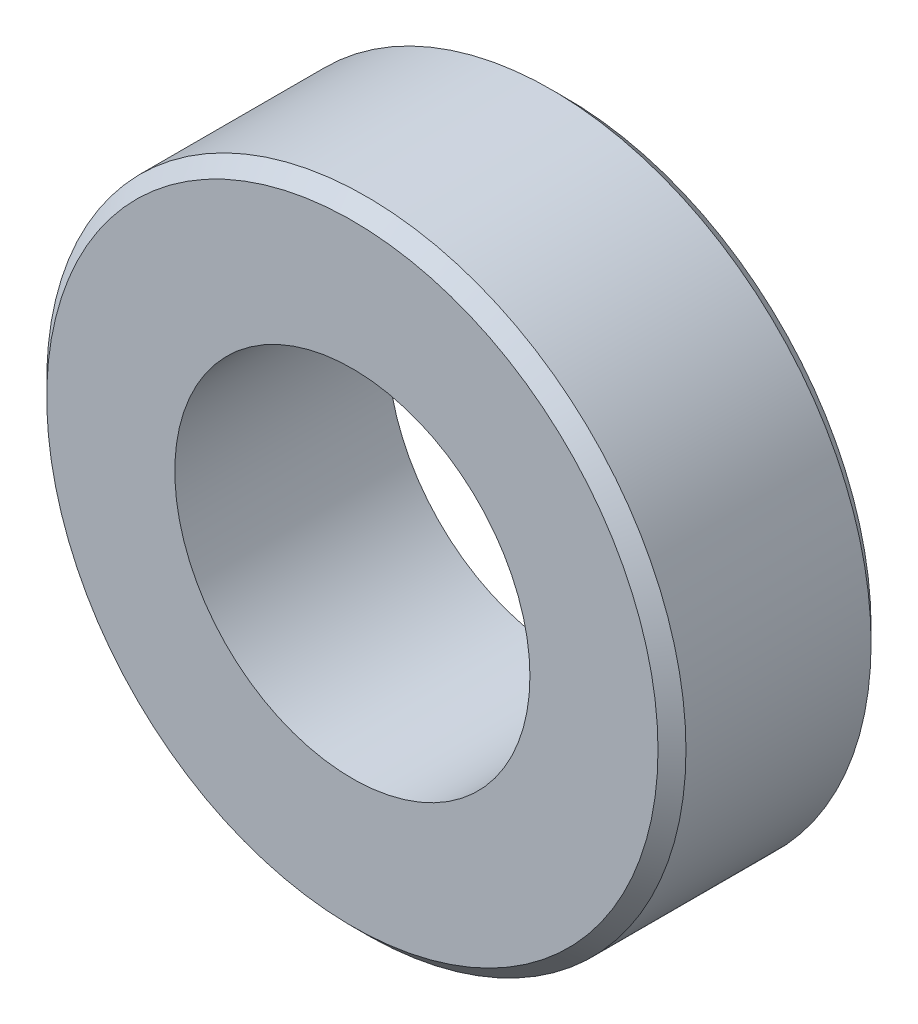
ISO-10303-21;
HEADER;
FILE_DESCRIPTION(('STEP AP214'),'2;1');
FILE_NAME('part.step','',(''),(''),'','','');
FILE_SCHEMA(('AUTOMOTIVE_DESIGN { 1 0 10303 214 1 1 1 1 }'));
ENDSEC;
DATA;
#1=APPLICATION_CONTEXT('core data for automotive mechanical design processes');
#2=APPLICATION_PROTOCOL_DEFINITION('international standard','automotive_design',2000,#1);
#3=PRODUCT_CONTEXT('',#1,'mechanical');
#4=PRODUCT('Part','Part','',(#3));
#5=PRODUCT_RELATED_PRODUCT_CATEGORY('part','',(#4));
#6=PRODUCT_DEFINITION_FORMATION('','',#4);
#7=PRODUCT_DEFINITION_CONTEXT('part definition',#1,'design');
#8=PRODUCT_DEFINITION('design','',#6,#7);
#9=PRODUCT_DEFINITION_SHAPE('','',#8);
#10=(LENGTH_UNIT() NAMED_UNIT(*) SI_UNIT(.MILLI.,.METRE.));
#11=(NAMED_UNIT(*) PLANE_ANGLE_UNIT() SI_UNIT($,.RADIAN.));
#12=(NAMED_UNIT(*) SI_UNIT($,.STERADIAN.) SOLID_ANGLE_UNIT());
#13=UNCERTAINTY_MEASURE_WITH_UNIT(LENGTH_MEASURE(1.E-05),#10,'distance_accuracy_value','');
#14=(GEOMETRIC_REPRESENTATION_CONTEXT(3) GLOBAL_UNCERTAINTY_ASSIGNED_CONTEXT((#13)) GLOBAL_UNIT_ASSIGNED_CONTEXT((#10,
#11,#12)) REPRESENTATION_CONTEXT('',''));
#15=CARTESIAN_POINT('',(0.,0.,0.));
#16=DIRECTION('',(0.,0.,1.));
#17=DIRECTION('',(1.,0.,0.));
#18=AXIS2_PLACEMENT_3D('',#15,#16,#17);
#19=CARTESIAN_POINT('',(0.,0.,3.81));
#20=DIRECTION('',(0.,0.,1.));
#21=DIRECTION('',(1.,0.,0.));
#22=AXIS2_PLACEMENT_3D('',#19,#20,#21);
#23=PLANE('',#22);
#24=CARTESIAN_POINT('',(0.,0.,3.81));
#25=DIRECTION('',(0.,0.,1.));
#26=DIRECTION('',(1.,0.,0.));
#27=AXIS2_PLACEMENT_3D('',#24,#25,#26);
#28=CIRCLE('',#27,10.93);
#29=CARTESIAN_POINT('',(10.93,0.,3.81));
#30=VERTEX_POINT('',#29);
#31=EDGE_CURVE('E10',#30,#30,#28,.T.);
#32=ORIENTED_EDGE('',*,*,#31,.T.);
#33=EDGE_LOOP('',(#32));
#34=FACE_BOUND('',#33,.T.);
#35=CARTESIAN_POINT('',(0.,0.,3.81));
#36=DIRECTION('',(0.,0.,1.));
#37=DIRECTION('',(1.,0.,0.));
#38=AXIS2_PLACEMENT_3D('',#35,#36,#37);
#39=CIRCLE('',#38,6.35);
#40=CARTESIAN_POINT('',(6.35,0.,3.81));
#41=VERTEX_POINT('',#40);
#42=EDGE_CURVE('E51',#41,#41,#39,.T.);
#43=ORIENTED_EDGE('',*,*,#42,.F.);
#44=EDGE_LOOP('',(#43));
#45=FACE_BOUND('',#44,.T.);
#46=ADVANCED_FACE('F31',(#34,#45),#23,.T.);
#47=CARTESIAN_POINT('',(0.,0.,-3.81));
#48=DIRECTION('',(0.,0.,1.));
#49=DIRECTION('',(1.,0.,0.));
#50=AXIS2_PLACEMENT_3D('',#47,#48,#49);
#51=PLANE('',#50);
#52=CARTESIAN_POINT('',(0.,0.,-3.81));
#53=DIRECTION('',(0.,0.,1.));
#54=DIRECTION('',(1.,0.,0.));
#55=AXIS2_PLACEMENT_3D('',#52,#53,#54);
#56=CIRCLE('',#55,10.93);
#57=CARTESIAN_POINT('',(10.93,0.,-3.81));
#58=VERTEX_POINT('',#57);
#59=EDGE_CURVE('E38',#58,#58,#56,.F.);
#60=ORIENTED_EDGE('',*,*,#59,.T.);
#61=EDGE_LOOP('',(#60));
#62=FACE_BOUND('',#61,.T.);
#63=CARTESIAN_POINT('',(0.,0.,-3.81));
#64=DIRECTION('',(0.,0.,1.));
#65=DIRECTION('',(1.,0.,0.));
#66=AXIS2_PLACEMENT_3D('',#63,#64,#65);
#67=CIRCLE('',#66,6.35);
#68=CARTESIAN_POINT('',(6.35,0.,-3.81));
#69=VERTEX_POINT('',#68);
#70=EDGE_CURVE('E52',#69,#69,#67,.T.);
#71=ORIENTED_EDGE('',*,*,#70,.T.);
#72=EDGE_LOOP('',(#71));
#73=FACE_BOUND('',#72,.T.);
#74=ADVANCED_FACE('F62',(#62,#73),#51,.F.);
#75=CARTESIAN_POINT('',(0.,0.,3.81));
#76=DIRECTION('',(0.,0.,-1.));
#77=DIRECTION('',(-1.,0.,0.));
#78=AXIS2_PLACEMENT_3D('',#75,#76,#77);
#79=CYLINDRICAL_SURFACE('',#78,11.43);
#80=CARTESIAN_POINT('',(0.,0.,-3.31));
#81=DIRECTION('',(0.,0.,1.));
#82=DIRECTION('',(1.,0.,0.));
#83=AXIS2_PLACEMENT_3D('',#80,#81,#82);
#84=CIRCLE('',#83,11.43);
#85=CARTESIAN_POINT('',(11.43,0.,-3.31));
#86=VERTEX_POINT('',#85);
#87=EDGE_CURVE('E42',#86,#86,#84,.T.);
#88=ORIENTED_EDGE('',*,*,#87,.T.);
#89=EDGE_LOOP('',(#88));
#90=FACE_BOUND('',#89,.T.);
#91=CARTESIAN_POINT('',(0.,0.,3.31));
#92=DIRECTION('',(0.,0.,1.));
#93=DIRECTION('',(1.,0.,0.));
#94=AXIS2_PLACEMENT_3D('',#91,#92,#93);
#95=CIRCLE('',#94,11.43);
#96=CARTESIAN_POINT('',(11.43,0.,3.31));
#97=VERTEX_POINT('',#96);
#98=EDGE_CURVE('E46',#97,#97,#95,.F.);
#99=ORIENTED_EDGE('',*,*,#98,.T.);
#100=EDGE_LOOP('',(#99));
#101=FACE_BOUND('',#100,.T.);
#102=ADVANCED_FACE('F67',(#90,#101),#79,.T.);
#103=CARTESIAN_POINT('',(0.,0.,3.81));
#104=DIRECTION('',(0.,0.,-1.));
#105=DIRECTION('',(-1.,0.,0.));
#106=AXIS2_PLACEMENT_3D('',#103,#104,#105);
#107=CYLINDRICAL_SURFACE('',#106,6.35);
#108=ORIENTED_EDGE('',*,*,#42,.T.);
#109=EDGE_LOOP('',(#108));
#110=FACE_BOUND('',#109,.T.);
#111=ORIENTED_EDGE('',*,*,#70,.F.);
#112=EDGE_LOOP('',(#111));
#113=FACE_BOUND('',#112,.T.);
#114=ADVANCED_FACE('F58',(#110,#113),#107,.F.);
#115=CARTESIAN_POINT('',(0.,0.,-3.31));
#116=DIRECTION('',(0.,0.,1.));
#117=DIRECTION('',(1.,0.,0.));
#118=AXIS2_PLACEMENT_3D('',#115,#116,#117);
#119=CONICAL_SURFACE('',#118,11.43,0.78539816339745);
#120=ORIENTED_EDGE('',*,*,#59,.F.);
#121=EDGE_LOOP('',(#120));
#122=FACE_BOUND('',#121,.T.);
#123=ORIENTED_EDGE('',*,*,#87,.F.);
#124=EDGE_LOOP('',(#123));
#125=FACE_BOUND('',#124,.T.);
#126=ADVANCED_FACE('F73',(#122,#125),#119,.T.);
#127=CARTESIAN_POINT('',(0.,0.,3.81));
#128=DIRECTION('',(0.,0.,-1.));
#129=DIRECTION('',(-1.,0.,0.));
#130=AXIS2_PLACEMENT_3D('',#127,#128,#129);
#131=CONICAL_SURFACE('',#130,10.93,0.785398163397452);
#132=ORIENTED_EDGE('',*,*,#98,.F.);
#133=EDGE_LOOP('',(#132));
#134=FACE_BOUND('',#133,.T.);
#135=ORIENTED_EDGE('',*,*,#31,.F.);
#136=EDGE_LOOP('',(#135));
#137=FACE_BOUND('',#136,.T.);
#138=ADVANCED_FACE('F33',(#134,#137),#131,.T.);
#139=CLOSED_SHELL('',(#46,#74,#102,#114,#126,#138));
#140=MANIFOLD_SOLID_BREP('B2',#139);
#141=ADVANCED_BREP_SHAPE_REPRESENTATION('',(#18,#140),#14);
#142=SHAPE_DEFINITION_REPRESENTATION(#9,#141);
ENDSEC;
END-ISO-10303-21;
